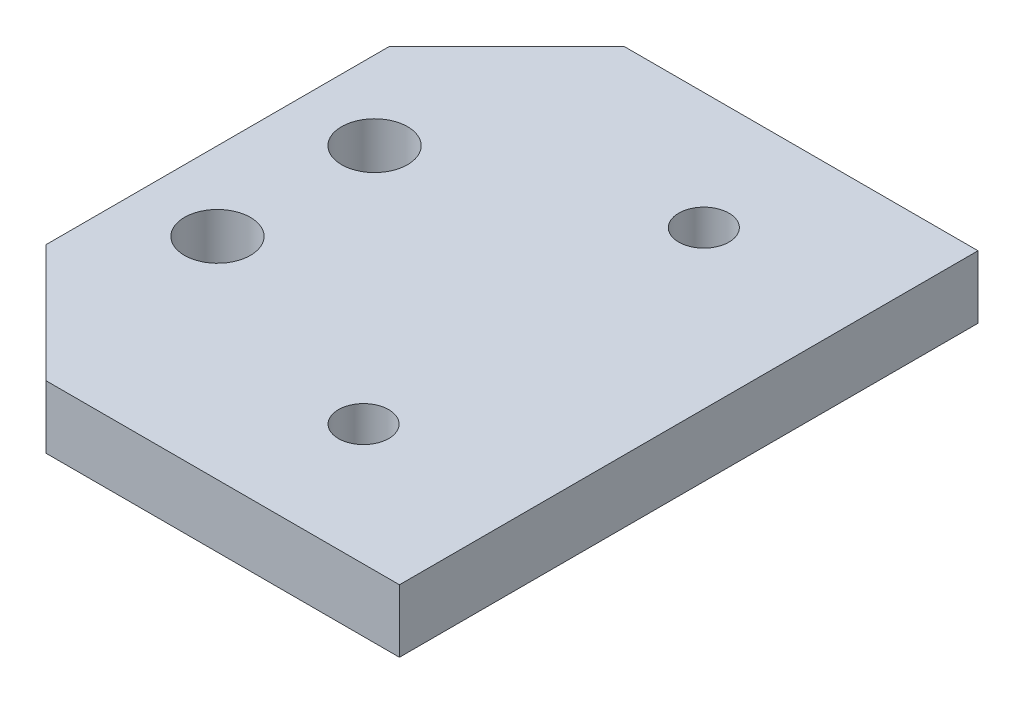
ISO-10303-21;
HEADER;
FILE_DESCRIPTION(('STEP AP214'),'2;1');
FILE_NAME('part.step','',(''),(''),'','','');
FILE_SCHEMA(('AUTOMOTIVE_DESIGN { 1 0 10303 214 1 1 1 1 }'));
ENDSEC;
DATA;
#1=APPLICATION_CONTEXT('core data for automotive mechanical design processes');
#2=APPLICATION_PROTOCOL_DEFINITION('international standard','automotive_design',2000,#1);
#3=PRODUCT_CONTEXT('',#1,'mechanical');
#4=PRODUCT('Part','Part','',(#3));
#5=PRODUCT_RELATED_PRODUCT_CATEGORY('part','',(#4));
#6=PRODUCT_DEFINITION_FORMATION('','',#4);
#7=PRODUCT_DEFINITION_CONTEXT('part definition',#1,'design');
#8=PRODUCT_DEFINITION('design','',#6,#7);
#9=PRODUCT_DEFINITION_SHAPE('','',#8);
#10=(LENGTH_UNIT() NAMED_UNIT(*) SI_UNIT(.MILLI.,.METRE.));
#11=(NAMED_UNIT(*) PLANE_ANGLE_UNIT() SI_UNIT($,.RADIAN.));
#12=(NAMED_UNIT(*) SI_UNIT($,.STERADIAN.) SOLID_ANGLE_UNIT());
#13=UNCERTAINTY_MEASURE_WITH_UNIT(LENGTH_MEASURE(1.E-05),#10,'distance_accuracy_value','');
#14=(GEOMETRIC_REPRESENTATION_CONTEXT(3) GLOBAL_UNCERTAINTY_ASSIGNED_CONTEXT((#13)) GLOBAL_UNIT_ASSIGNED_CONTEXT((#10,
#11,#12)) REPRESENTATION_CONTEXT('',''));
#15=CARTESIAN_POINT('',(0.,0.,0.));
#16=DIRECTION('',(0.,0.,1.));
#17=DIRECTION('',(1.,0.,0.));
#18=AXIS2_PLACEMENT_3D('',#15,#16,#17);
#19=CARTESIAN_POINT('',(0.,4.,0.));
#20=DIRECTION('',(0.,-1.,0.));
#21=DIRECTION('',(0.,0.,-1.));
#22=AXIS2_PLACEMENT_3D('',#19,#20,#21);
#23=PLANE('',#22);
#24=CARTESIAN_POINT('',(20.,4.,-29.3778251349138));
#25=DIRECTION('',(0.,1.,0.));
#26=DIRECTION('',(0.,0.,1.));
#27=AXIS2_PLACEMENT_3D('',#24,#25,#26);
#28=CIRCLE('',#27,1.6);
#29=CARTESIAN_POINT('',(20.,4.,-27.7778251349138));
#30=VERTEX_POINT('',#29);
#31=EDGE_CURVE('E205',#30,#30,#28,.T.);
#32=ORIENTED_EDGE('',*,*,#31,.F.);
#33=EDGE_LOOP('',(#32));
#34=FACE_BOUND('',#33,.T.);
#35=CARTESIAN_POINT('',(20.,4.,-7.71633932616848));
#36=DIRECTION('',(0.,1.,0.));
#37=DIRECTION('',(0.,0.,1.));
#38=AXIS2_PLACEMENT_3D('',#35,#36,#37);
#39=CIRCLE('',#38,1.6);
#40=CARTESIAN_POINT('',(20.,4.,-6.11633932616848));
#41=VERTEX_POINT('',#40);
#42=EDGE_CURVE('E206',#41,#41,#39,.T.);
#43=ORIENTED_EDGE('',*,*,#42,.F.);
#44=EDGE_LOOP('',(#43));
#45=FACE_BOUND('',#44,.T.);
#46=DIRECTION('',(-1.,0.,0.));
#47=VECTOR('',#46,1.);
#48=CARTESIAN_POINT('',(0.,4.,-36.83));
#49=LINE('',#48,#47);
#50=CARTESIAN_POINT('',(30.,4.,-36.83));
#51=VERTEX_POINT('',#50);
#52=CARTESIAN_POINT('',(7.50000000000003,4.,-36.83));
#53=VERTEX_POINT('',#52);
#54=EDGE_CURVE('E127',#51,#53,#49,.T.);
#55=ORIENTED_EDGE('',*,*,#54,.T.);
#56=DIRECTION('',(0.707106781186549,0.,-0.707106781186546));
#57=VECTOR('',#56,1.);
#58=CARTESIAN_POINT('',(0.,4.,-29.33));
#59=LINE('',#58,#57);
#60=CARTESIAN_POINT('',(0.,4.,-29.33));
#61=VERTEX_POINT('',#60);
#62=EDGE_CURVE('E60',#53,#61,#59,.F.);
#63=ORIENTED_EDGE('',*,*,#62,.T.);
#64=DIRECTION('',(0.,0.,1.));
#65=VECTOR('',#64,1.);
#66=CARTESIAN_POINT('',(0.,4.,0.));
#67=LINE('',#66,#65);
#68=CARTESIAN_POINT('',(0.,4.,-7.50000000000003));
#69=VERTEX_POINT('',#68);
#70=EDGE_CURVE('E113',#61,#69,#67,.T.);
#71=ORIENTED_EDGE('',*,*,#70,.T.);
#72=DIRECTION('',(-0.707106781186547,0.,-0.707106781186549));
#73=VECTOR('',#72,1.);
#74=CARTESIAN_POINT('',(7.50000000000001,4.,0.));
#75=LINE('',#74,#73);
#76=CARTESIAN_POINT('',(7.50000000000001,4.,0.));
#77=VERTEX_POINT('',#76);
#78=EDGE_CURVE('E67',#69,#77,#75,.F.);
#79=ORIENTED_EDGE('',*,*,#78,.T.);
#80=DIRECTION('',(1.,0.,0.));
#81=VECTOR('',#80,1.);
#82=CARTESIAN_POINT('',(0.,4.,0.));
#83=LINE('',#82,#81);
#84=CARTESIAN_POINT('',(30.,4.,0.));
#85=VERTEX_POINT('',#84);
#86=EDGE_CURVE('E105',#77,#85,#83,.T.);
#87=ORIENTED_EDGE('',*,*,#86,.T.);
#88=DIRECTION('',(0.,0.,-1.));
#89=VECTOR('',#88,1.);
#90=CARTESIAN_POINT('',(30.,4.,0.));
#91=LINE('',#90,#89);
#92=EDGE_CURVE('E109',#85,#51,#91,.T.);
#93=ORIENTED_EDGE('',*,*,#92,.T.);
#94=EDGE_LOOP('',(#55,#63,#71,#79,#87,#93));
#95=FACE_BOUND('',#94,.T.);
#96=CARTESIAN_POINT('',(5.,4.,-23.415));
#97=DIRECTION('',(0.,1.,0.));
#98=DIRECTION('',(0.,0.,1.));
#99=AXIS2_PLACEMENT_3D('',#96,#97,#98);
#100=CIRCLE('',#99,2.1);
#101=CARTESIAN_POINT('',(5.,4.,-21.315));
#102=VERTEX_POINT('',#101);
#103=EDGE_CURVE('E135',#102,#102,#100,.T.);
#104=ORIENTED_EDGE('',*,*,#103,.F.);
#105=EDGE_LOOP('',(#104));
#106=FACE_BOUND('',#105,.T.);
#107=CARTESIAN_POINT('',(5.,4.,-13.415));
#108=DIRECTION('',(0.,1.,0.));
#109=DIRECTION('',(0.,0.,1.));
#110=AXIS2_PLACEMENT_3D('',#107,#108,#109);
#111=CIRCLE('',#110,2.1);
#112=CARTESIAN_POINT('',(5.,4.,-11.315));
#113=VERTEX_POINT('',#112);
#114=EDGE_CURVE('E216',#113,#113,#111,.T.);
#115=ORIENTED_EDGE('',*,*,#114,.F.);
#116=EDGE_LOOP('',(#115));
#117=FACE_BOUND('',#116,.T.);
#118=ADVANCED_FACE('F51',(#34,#45,#95,#106,#117),#23,.F.);
#119=CARTESIAN_POINT('',(0.,0.,0.));
#120=DIRECTION('',(0.,-1.,0.));
#121=DIRECTION('',(0.,0.,-1.));
#122=AXIS2_PLACEMENT_3D('',#119,#120,#121);
#123=PLANE('',#122);
#124=CARTESIAN_POINT('',(20.,0.,-29.3778251349138));
#125=DIRECTION('',(0.,1.,0.));
#126=DIRECTION('',(0.,0.,1.));
#127=AXIS2_PLACEMENT_3D('',#124,#125,#126);
#128=CIRCLE('',#127,1.6);
#129=CARTESIAN_POINT('',(20.,0.,-27.7778251349138));
#130=VERTEX_POINT('',#129);
#131=EDGE_CURVE('E203',#130,#130,#128,.T.);
#132=ORIENTED_EDGE('',*,*,#131,.T.);
#133=EDGE_LOOP('',(#132));
#134=FACE_BOUND('',#133,.T.);
#135=CARTESIAN_POINT('',(20.,0.,-7.71633932616848));
#136=DIRECTION('',(0.,1.,0.));
#137=DIRECTION('',(0.,0.,1.));
#138=AXIS2_PLACEMENT_3D('',#135,#136,#137);
#139=CIRCLE('',#138,1.6);
#140=CARTESIAN_POINT('',(20.,0.,-6.11633932616848));
#141=VERTEX_POINT('',#140);
#142=EDGE_CURVE('E211',#141,#141,#139,.T.);
#143=ORIENTED_EDGE('',*,*,#142,.T.);
#144=EDGE_LOOP('',(#143));
#145=FACE_BOUND('',#144,.T.);
#146=CARTESIAN_POINT('',(5.,0.,-23.415));
#147=DIRECTION('',(0.,1.,0.));
#148=DIRECTION('',(0.,0.,1.));
#149=AXIS2_PLACEMENT_3D('',#146,#147,#148);
#150=CIRCLE('',#149,2.1);
#151=CARTESIAN_POINT('',(5.,0.,-21.315));
#152=VERTEX_POINT('',#151);
#153=EDGE_CURVE('E219',#152,#152,#150,.T.);
#154=ORIENTED_EDGE('',*,*,#153,.T.);
#155=EDGE_LOOP('',(#154));
#156=FACE_BOUND('',#155,.T.);
#157=DIRECTION('',(0.,0.,1.));
#158=VECTOR('',#157,1.);
#159=CARTESIAN_POINT('',(0.,0.,0.));
#160=LINE('',#159,#158);
#161=CARTESIAN_POINT('',(0.,0.,-29.33));
#162=VERTEX_POINT('',#161);
#163=CARTESIAN_POINT('',(0.,0.,-7.50000000000003));
#164=VERTEX_POINT('',#163);
#165=EDGE_CURVE('E132',#162,#164,#160,.T.);
#166=ORIENTED_EDGE('',*,*,#165,.F.);
#167=DIRECTION('',(-0.707106781186549,0.,0.707106781186546));
#168=VECTOR('',#167,1.);
#169=CARTESIAN_POINT('',(-14.665,0.,-14.6650000000001));
#170=LINE('',#169,#168);
#171=CARTESIAN_POINT('',(7.50000000000003,0.,-36.83));
#172=VERTEX_POINT('',#171);
#173=EDGE_CURVE('E148',#162,#172,#170,.F.);
#174=ORIENTED_EDGE('',*,*,#173,.T.);
#175=DIRECTION('',(-1.,0.,0.));
#176=VECTOR('',#175,1.);
#177=CARTESIAN_POINT('',(0.,0.,-36.83));
#178=LINE('',#177,#176);
#179=CARTESIAN_POINT('',(30.,0.,-36.83));
#180=VERTEX_POINT('',#179);
#181=EDGE_CURVE('E139',#180,#172,#178,.T.);
#182=ORIENTED_EDGE('',*,*,#181,.F.);
#183=DIRECTION('',(0.,0.,-1.));
#184=VECTOR('',#183,1.);
#185=CARTESIAN_POINT('',(30.,0.,0.));
#186=LINE('',#185,#184);
#187=CARTESIAN_POINT('',(30.,0.,0.));
#188=VERTEX_POINT('',#187);
#189=EDGE_CURVE('E137',#188,#180,#186,.T.);
#190=ORIENTED_EDGE('',*,*,#189,.F.);
#191=DIRECTION('',(1.,0.,0.));
#192=VECTOR('',#191,1.);
#193=CARTESIAN_POINT('',(0.,0.,0.));
#194=LINE('',#193,#192);
#195=CARTESIAN_POINT('',(7.50000000000001,0.,0.));
#196=VERTEX_POINT('',#195);
#197=EDGE_CURVE('E119',#196,#188,#194,.T.);
#198=ORIENTED_EDGE('',*,*,#197,.F.);
#199=DIRECTION('',(0.707106781186547,0.,0.707106781186549));
#200=VECTOR('',#199,1.);
#201=CARTESIAN_POINT('',(3.75000000000001,0.,-3.75));
#202=LINE('',#201,#200);
#203=EDGE_CURVE('E146',#196,#164,#202,.F.);
#204=ORIENTED_EDGE('',*,*,#203,.T.);
#205=EDGE_LOOP('',(#166,#174,#182,#190,#198,#204));
#206=FACE_BOUND('',#205,.T.);
#207=CARTESIAN_POINT('',(5.,0.,-13.415));
#208=DIRECTION('',(0.,1.,0.));
#209=DIRECTION('',(0.,0.,1.));
#210=AXIS2_PLACEMENT_3D('',#207,#208,#209);
#211=CIRCLE('',#210,2.1);
#212=CARTESIAN_POINT('',(5.,0.,-11.315));
#213=VERTEX_POINT('',#212);
#214=EDGE_CURVE('E208',#213,#213,#211,.T.);
#215=ORIENTED_EDGE('',*,*,#214,.T.);
#216=EDGE_LOOP('',(#215));
#217=FACE_BOUND('',#216,.T.);
#218=ADVANCED_FACE('F162',(#134,#145,#156,#206,#217),#123,.T.);
#219=CARTESIAN_POINT('',(0.,4.,0.));
#220=DIRECTION('',(1.,0.,0.));
#221=DIRECTION('',(0.,0.,-1.));
#222=AXIS2_PLACEMENT_3D('',#219,#220,#221);
#223=PLANE('',#222);
#224=ORIENTED_EDGE('',*,*,#70,.F.);
#225=DIRECTION('',(0.,-1.,0.));
#226=VECTOR('',#225,1.);
#227=CARTESIAN_POINT('',(0.,4.,-29.33));
#228=LINE('',#227,#226);
#229=EDGE_CURVE('E143',#61,#162,#228,.T.);
#230=ORIENTED_EDGE('',*,*,#229,.T.);
#231=ORIENTED_EDGE('',*,*,#165,.T.);
#232=DIRECTION('',(0.,1.,0.));
#233=VECTOR('',#232,1.);
#234=CARTESIAN_POINT('',(0.,4.,-7.50000000000003));
#235=LINE('',#234,#233);
#236=EDGE_CURVE('E122',#164,#69,#235,.T.);
#237=ORIENTED_EDGE('',*,*,#236,.T.);
#238=EDGE_LOOP('',(#224,#230,#231,#237));
#239=FACE_BOUND('',#238,.T.);
#240=ADVANCED_FACE('F156',(#239),#223,.F.);
#241=CARTESIAN_POINT('',(0.,4.,0.));
#242=DIRECTION('',(0.,0.,-1.));
#243=DIRECTION('',(-1.,0.,0.));
#244=AXIS2_PLACEMENT_3D('',#241,#242,#243);
#245=PLANE('',#244);
#246=ORIENTED_EDGE('',*,*,#86,.F.);
#247=DIRECTION('',(0.,-1.,0.));
#248=VECTOR('',#247,1.);
#249=CARTESIAN_POINT('',(7.50000000000001,4.,0.));
#250=LINE('',#249,#248);
#251=EDGE_CURVE('E11',#77,#196,#250,.T.);
#252=ORIENTED_EDGE('',*,*,#251,.T.);
#253=ORIENTED_EDGE('',*,*,#197,.T.);
#254=DIRECTION('',(0.,-1.,0.));
#255=VECTOR('',#254,1.);
#256=CARTESIAN_POINT('',(30.,4.,0.));
#257=LINE('',#256,#255);
#258=EDGE_CURVE('E116',#85,#188,#257,.T.);
#259=ORIENTED_EDGE('',*,*,#258,.F.);
#260=EDGE_LOOP('',(#246,#252,#253,#259));
#261=FACE_BOUND('',#260,.T.);
#262=ADVANCED_FACE('F117',(#261),#245,.F.);
#263=CARTESIAN_POINT('',(30.,4.,0.));
#264=DIRECTION('',(-1.,0.,0.));
#265=DIRECTION('',(0.,0.,1.));
#266=AXIS2_PLACEMENT_3D('',#263,#264,#265);
#267=PLANE('',#266);
#268=ORIENTED_EDGE('',*,*,#189,.T.);
#269=DIRECTION('',(0.,-1.,0.));
#270=VECTOR('',#269,1.);
#271=CARTESIAN_POINT('',(30.,4.,-36.83));
#272=LINE('',#271,#270);
#273=EDGE_CURVE('E123',#51,#180,#272,.T.);
#274=ORIENTED_EDGE('',*,*,#273,.F.);
#275=ORIENTED_EDGE('',*,*,#92,.F.);
#276=ORIENTED_EDGE('',*,*,#258,.T.);
#277=EDGE_LOOP('',(#268,#274,#275,#276));
#278=FACE_BOUND('',#277,.T.);
#279=ADVANCED_FACE('F125',(#278),#267,.F.);
#280=CARTESIAN_POINT('',(0.,4.,-36.83));
#281=DIRECTION('',(0.,0.,1.));
#282=DIRECTION('',(1.,0.,0.));
#283=AXIS2_PLACEMENT_3D('',#280,#281,#282);
#284=PLANE('',#283);
#285=ORIENTED_EDGE('',*,*,#181,.T.);
#286=DIRECTION('',(0.,1.,0.));
#287=VECTOR('',#286,1.);
#288=CARTESIAN_POINT('',(7.50000000000003,4.,-36.83));
#289=LINE('',#288,#287);
#290=EDGE_CURVE('E75',#172,#53,#289,.T.);
#291=ORIENTED_EDGE('',*,*,#290,.T.);
#292=ORIENTED_EDGE('',*,*,#54,.F.);
#293=ORIENTED_EDGE('',*,*,#273,.T.);
#294=EDGE_LOOP('',(#285,#291,#292,#293));
#295=FACE_BOUND('',#294,.T.);
#296=ADVANCED_FACE('F164',(#295),#284,.F.);
#297=CARTESIAN_POINT('',(5.,4.,-23.415));
#298=DIRECTION('',(0.,-1.,0.));
#299=DIRECTION('',(0.,0.,-1.));
#300=AXIS2_PLACEMENT_3D('',#297,#298,#299);
#301=CYLINDRICAL_SURFACE('',#300,2.1);
#302=ORIENTED_EDGE('',*,*,#103,.T.);
#303=EDGE_LOOP('',(#302));
#304=FACE_BOUND('',#303,.T.);
#305=ORIENTED_EDGE('',*,*,#153,.F.);
#306=EDGE_LOOP('',(#305));
#307=FACE_BOUND('',#306,.T.);
#308=ADVANCED_FACE('F166',(#304,#307),#301,.F.);
#309=CARTESIAN_POINT('',(5.,4.,-13.415));
#310=DIRECTION('',(0.,-1.,0.));
#311=DIRECTION('',(0.,0.,-1.));
#312=AXIS2_PLACEMENT_3D('',#309,#310,#311);
#313=CYLINDRICAL_SURFACE('',#312,2.1);
#314=ORIENTED_EDGE('',*,*,#114,.T.);
#315=EDGE_LOOP('',(#314));
#316=FACE_BOUND('',#315,.T.);
#317=ORIENTED_EDGE('',*,*,#214,.F.);
#318=EDGE_LOOP('',(#317));
#319=FACE_BOUND('',#318,.T.);
#320=ADVANCED_FACE('F173',(#316,#319),#313,.F.);
#321=CARTESIAN_POINT('',(0.,4.,-29.33));
#322=DIRECTION('',(0.707106781186546,0.,0.707106781186549));
#323=DIRECTION('',(0.,-1.,0.));
#324=AXIS2_PLACEMENT_3D('',#321,#322,#323);
#325=PLANE('',#324);
#326=ORIENTED_EDGE('',*,*,#62,.F.);
#327=ORIENTED_EDGE('',*,*,#290,.F.);
#328=ORIENTED_EDGE('',*,*,#173,.F.);
#329=ORIENTED_EDGE('',*,*,#229,.F.);
#330=EDGE_LOOP('',(#326,#327,#328,#329));
#331=FACE_BOUND('',#330,.T.);
#332=ADVANCED_FACE('F159',(#331),#325,.F.);
#333=CARTESIAN_POINT('',(7.50000000000001,4.,0.));
#334=DIRECTION('',(0.707106781186548,0.,-0.707106781186546));
#335=DIRECTION('',(0.,-1.,0.));
#336=AXIS2_PLACEMENT_3D('',#333,#334,#335);
#337=PLANE('',#336);
#338=ORIENTED_EDGE('',*,*,#78,.F.);
#339=ORIENTED_EDGE('',*,*,#236,.F.);
#340=ORIENTED_EDGE('',*,*,#203,.F.);
#341=ORIENTED_EDGE('',*,*,#251,.F.);
#342=EDGE_LOOP('',(#338,#339,#340,#341));
#343=FACE_BOUND('',#342,.T.);
#344=ADVANCED_FACE('F54',(#343),#337,.F.);
#345=CARTESIAN_POINT('',(20.,0.,-7.71633932616848));
#346=DIRECTION('',(0.,1.,0.));
#347=DIRECTION('',(0.,0.,1.));
#348=AXIS2_PLACEMENT_3D('',#345,#346,#347);
#349=CYLINDRICAL_SURFACE('',#348,1.6);
#350=ORIENTED_EDGE('',*,*,#142,.F.);
#351=EDGE_LOOP('',(#350));
#352=FACE_BOUND('',#351,.T.);
#353=ORIENTED_EDGE('',*,*,#42,.T.);
#354=EDGE_LOOP('',(#353));
#355=FACE_BOUND('',#354,.T.);
#356=ADVANCED_FACE('F191',(#352,#355),#349,.F.);
#357=CARTESIAN_POINT('',(20.,0.,-29.3778251349138));
#358=DIRECTION('',(0.,1.,0.));
#359=DIRECTION('',(0.,0.,1.));
#360=AXIS2_PLACEMENT_3D('',#357,#358,#359);
#361=CYLINDRICAL_SURFACE('',#360,1.6);
#362=ORIENTED_EDGE('',*,*,#131,.F.);
#363=EDGE_LOOP('',(#362));
#364=FACE_BOUND('',#363,.T.);
#365=ORIENTED_EDGE('',*,*,#31,.T.);
#366=EDGE_LOOP('',(#365));
#367=FACE_BOUND('',#366,.T.);
#368=ADVANCED_FACE('F194',(#364,#367),#361,.F.);
#369=CLOSED_SHELL('',(#118,#218,#240,#262,#279,#296,#308,#320,#332,#344,#356,#368));
#370=MANIFOLD_SOLID_BREP('B2',#369);
#371=ADVANCED_BREP_SHAPE_REPRESENTATION('',(#18,#370),#14);
#372=SHAPE_DEFINITION_REPRESENTATION(#9,#371);
ENDSEC;
END-ISO-10303-21;
